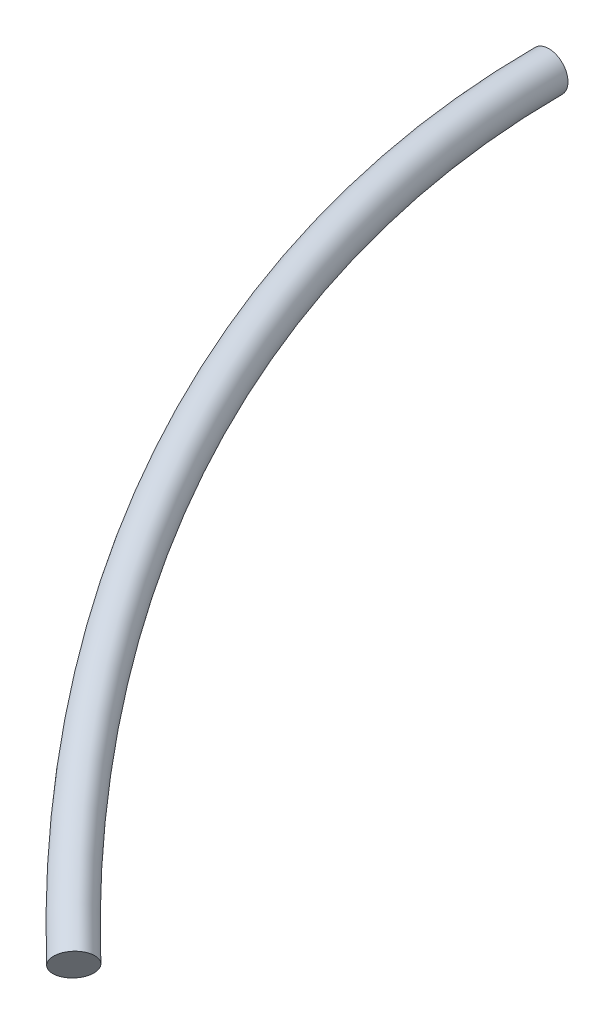
ISO-10303-21;
HEADER;
FILE_DESCRIPTION(('STEP AP214'),'2;1');
FILE_NAME('part.step','',(''),(''),'','','');
FILE_SCHEMA(('AUTOMOTIVE_DESIGN { 1 0 10303 214 1 1 1 1 }'));
ENDSEC;
DATA;
#1=APPLICATION_CONTEXT('core data for automotive mechanical design processes');
#2=APPLICATION_PROTOCOL_DEFINITION('international standard','automotive_design',2000,#1);
#3=PRODUCT_CONTEXT('',#1,'mechanical');
#4=PRODUCT('Part','Part','',(#3));
#5=PRODUCT_RELATED_PRODUCT_CATEGORY('part','',(#4));
#6=PRODUCT_DEFINITION_FORMATION('','',#4);
#7=PRODUCT_DEFINITION_CONTEXT('part definition',#1,'design');
#8=PRODUCT_DEFINITION('design','',#6,#7);
#9=PRODUCT_DEFINITION_SHAPE('','',#8);
#10=(LENGTH_UNIT() NAMED_UNIT(*) SI_UNIT(.MILLI.,.METRE.));
#11=(NAMED_UNIT(*) PLANE_ANGLE_UNIT() SI_UNIT($,.RADIAN.));
#12=(NAMED_UNIT(*) SI_UNIT($,.STERADIAN.) SOLID_ANGLE_UNIT());
#13=UNCERTAINTY_MEASURE_WITH_UNIT(LENGTH_MEASURE(1.E-05),#10,'distance_accuracy_value','');
#14=(GEOMETRIC_REPRESENTATION_CONTEXT(3) GLOBAL_UNCERTAINTY_ASSIGNED_CONTEXT((#13)) GLOBAL_UNIT_ASSIGNED_CONTEXT((#10,
#11,#12)) REPRESENTATION_CONTEXT('',''));
#15=CARTESIAN_POINT('',(0.,0.,0.));
#16=DIRECTION('',(0.,0.,1.));
#17=DIRECTION('',(1.,0.,0.));
#18=AXIS2_PLACEMENT_3D('',#15,#16,#17);
#19=CARTESIAN_POINT('',(-1615.27755334556,-14986.9256988177,-8.88178419700125E-13));
#20=DIRECTION('',(-0.541311728767531,-0.840821986093791,0.));
#21=DIRECTION('',(0.840821986093791,-0.541311728767531,0.));
#22=AXIS2_PLACEMENT_3D('',#19,#20,#21);
#23=TOROIDAL_SURFACE('',#22,2703.0237308424,50.7999999999827);
#24=CARTESIAN_POINT('',(-3024.30564516822,-14079.8092759826,2120.87645122825));
#25=DIRECTION('',(0.659735069889869,-0.424730010771648,0.619962946882574));
#26=DIRECTION('',(0.731320791453793,0.172972649701638,-0.65973506988987));
#27=AXIS2_PLACEMENT_3D('',#24,#25,#26);
#28=CIRCLE('',#27,50.7999999999827);
#29=CARTESIAN_POINT('',(-3050.78659176437,-14062.7611406835,2160.7357105063));
#30=VERTEX_POINT('',#29);
#31=EDGE_CURVE('E10',#30,#30,#28,.T.);
#32=CARTESIAN_POINT('',(-3888.03933517112,-13523.7472501757,0.));
#33=DIRECTION('',(0.,0.,1.));
#34=DIRECTION('',(1.,0.,0.));
#35=AXIS2_PLACEMENT_3D('',#32,#33,#34);
#36=CIRCLE('',#35,50.7999999999827);
#37=CARTESIAN_POINT('',(-3930.75309206467,-13496.2486143544,0.));
#38=VERTEX_POINT('',#37);
#39=EDGE_CURVE('E41',#38,#38,#36,.T.);
#40=CARTESIAN_POINT('',(-1615.27755334556,-14986.9256988177,-8.88178419700125E-13));
#41=DIRECTION('',(-0.541311728767531,-0.840821986093791,0.));
#42=DIRECTION('',(0.840821986093791,-0.541311728767531,0.));
#43=AXIS2_PLACEMENT_3D('',#40,#41,#42);
#44=CIRCLE('',#43,2753.82373084239);
#45=EDGE_CURVE('',#30,#38,#44,.T.);
#46=ORIENTED_EDGE('',*,*,#31,.F.);
#47=ORIENTED_EDGE('',*,*,#39,.T.);
#48=ORIENTED_EDGE('',*,*,#45,.T.);
#49=ORIENTED_EDGE('',*,*,#45,.F.);
#50=EDGE_LOOP('',(#46,#48,#47,#49));
#51=FACE_BOUND('',#50,.T.);
#52=ADVANCED_FACE('F35',(#51),#23,.T.);
#53=CARTESIAN_POINT('',(-3024.30564516822,-14079.8092759826,2120.87645122825));
#54=DIRECTION('',(0.659735069889869,-0.424730010771648,0.619962946882574));
#55=DIRECTION('',(0.731320791453793,0.172972649701638,-0.65973506988987));
#56=AXIS2_PLACEMENT_3D('',#53,#54,#55);
#57=PLANE('',#56);
#58=ORIENTED_EDGE('',*,*,#31,.T.);
#59=EDGE_LOOP('',(#58));
#60=FACE_BOUND('',#59,.T.);
#61=ADVANCED_FACE('F50',(#60),#57,.T.);
#62=CARTESIAN_POINT('',(-3888.03933517112,-13523.7472501757,0.));
#63=DIRECTION('',(0.,0.,1.));
#64=DIRECTION('',(1.,0.,0.));
#65=AXIS2_PLACEMENT_3D('',#62,#63,#64);
#66=PLANE('',#65);
#67=ORIENTED_EDGE('',*,*,#39,.F.);
#68=EDGE_LOOP('',(#67));
#69=FACE_BOUND('',#68,.T.);
#70=ADVANCED_FACE('F48',(#69),#66,.F.);
#71=CLOSED_SHELL('',(#52,#61,#70));
#72=MANIFOLD_SOLID_BREP('B2',#71);
#73=ADVANCED_BREP_SHAPE_REPRESENTATION('',(#18,#72),#14);
#74=SHAPE_DEFINITION_REPRESENTATION(#9,#73);
ENDSEC;
END-ISO-10303-21;
